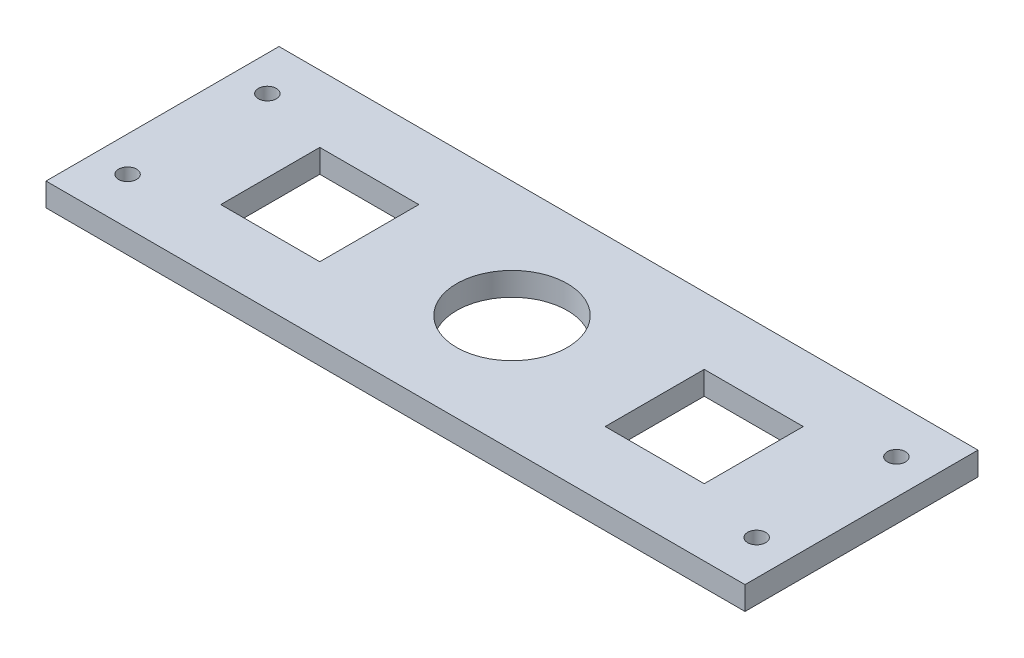
ISO-10303-21;
HEADER;
FILE_DESCRIPTION(('STEP AP214'),'2;1');
FILE_NAME('part.step','',(''),(''),'','','');
FILE_SCHEMA(('AUTOMOTIVE_DESIGN { 1 0 10303 214 1 1 1 1 }'));
ENDSEC;
DATA;
#1=APPLICATION_CONTEXT('core data for automotive mechanical design processes');
#2=APPLICATION_PROTOCOL_DEFINITION('international standard','automotive_design',2000,#1);
#3=PRODUCT_CONTEXT('',#1,'mechanical');
#4=PRODUCT('Part','Part','',(#3));
#5=PRODUCT_RELATED_PRODUCT_CATEGORY('part','',(#4));
#6=PRODUCT_DEFINITION_FORMATION('','',#4);
#7=PRODUCT_DEFINITION_CONTEXT('part definition',#1,'design');
#8=PRODUCT_DEFINITION('design','',#6,#7);
#9=PRODUCT_DEFINITION_SHAPE('','',#8);
#10=(LENGTH_UNIT() NAMED_UNIT(*) SI_UNIT(.MILLI.,.METRE.));
#11=(NAMED_UNIT(*) PLANE_ANGLE_UNIT() SI_UNIT($,.RADIAN.));
#12=(NAMED_UNIT(*) SI_UNIT($,.STERADIAN.) SOLID_ANGLE_UNIT());
#13=UNCERTAINTY_MEASURE_WITH_UNIT(LENGTH_MEASURE(1.E-05),#10,'distance_accuracy_value','');
#14=(GEOMETRIC_REPRESENTATION_CONTEXT(3) GLOBAL_UNCERTAINTY_ASSIGNED_CONTEXT((#13)) GLOBAL_UNIT_ASSIGNED_CONTEXT((#10,
#11,#12)) REPRESENTATION_CONTEXT('',''));
#15=CARTESIAN_POINT('',(0.,0.,0.));
#16=DIRECTION('',(0.,0.,1.));
#17=DIRECTION('',(1.,0.,0.));
#18=AXIS2_PLACEMENT_3D('',#15,#16,#17);
#19=CARTESIAN_POINT('',(0.,6.35,0.));
#20=DIRECTION('',(1.,0.,0.));
#21=DIRECTION('',(0.,0.,-1.));
#22=AXIS2_PLACEMENT_3D('',#19,#20,#21);
#23=PLANE('',#22);
#24=DIRECTION('',(0.,0.,1.));
#25=VECTOR('',#24,1.);
#26=CARTESIAN_POINT('',(0.,0.,0.));
#27=LINE('',#26,#25);
#28=CARTESIAN_POINT('',(0.,0.,-63.5));
#29=VERTEX_POINT('',#28);
#30=CARTESIAN_POINT('',(0.,0.,0.));
#31=VERTEX_POINT('',#30);
#32=EDGE_CURVE('E216',#29,#31,#27,.T.);
#33=ORIENTED_EDGE('',*,*,#32,.T.);
#34=DIRECTION('',(0.,-1.,0.));
#35=VECTOR('',#34,1.);
#36=CARTESIAN_POINT('',(0.,6.35,0.));
#37=LINE('',#36,#35);
#38=CARTESIAN_POINT('',(0.,6.35,0.));
#39=VERTEX_POINT('',#38);
#40=EDGE_CURVE('E12',#39,#31,#37,.T.);
#41=ORIENTED_EDGE('',*,*,#40,.F.);
#42=DIRECTION('',(0.,0.,1.));
#43=VECTOR('',#42,1.);
#44=CARTESIAN_POINT('',(0.,6.35,0.));
#45=LINE('',#44,#43);
#46=CARTESIAN_POINT('',(0.,6.35,-63.5));
#47=VERTEX_POINT('',#46);
#48=EDGE_CURVE('E223',#47,#39,#45,.T.);
#49=ORIENTED_EDGE('',*,*,#48,.F.);
#50=DIRECTION('',(0.,-1.,0.));
#51=VECTOR('',#50,1.);
#52=CARTESIAN_POINT('',(0.,6.35,-63.5));
#53=LINE('',#52,#51);
#54=EDGE_CURVE('E240',#47,#29,#53,.T.);
#55=ORIENTED_EDGE('',*,*,#54,.T.);
#56=EDGE_LOOP('',(#33,#41,#49,#55));
#57=FACE_BOUND('',#56,.T.);
#58=ADVANCED_FACE('F42',(#57),#23,.F.);
#59=CARTESIAN_POINT('',(0.,6.35,0.));
#60=DIRECTION('',(0.,0.,-1.));
#61=DIRECTION('',(-1.,0.,0.));
#62=AXIS2_PLACEMENT_3D('',#59,#60,#61);
#63=PLANE('',#62);
#64=DIRECTION('',(1.,0.,0.));
#65=VECTOR('',#64,1.);
#66=CARTESIAN_POINT('',(0.,0.,0.));
#67=LINE('',#66,#65);
#68=CARTESIAN_POINT('',(190.5,0.,0.));
#69=VERTEX_POINT('',#68);
#70=EDGE_CURVE('E243',#31,#69,#67,.T.);
#71=ORIENTED_EDGE('',*,*,#70,.T.);
#72=DIRECTION('',(0.,-1.,0.));
#73=VECTOR('',#72,1.);
#74=CARTESIAN_POINT('',(190.5,6.35,0.));
#75=LINE('',#74,#73);
#76=CARTESIAN_POINT('',(190.5,6.35,0.));
#77=VERTEX_POINT('',#76);
#78=EDGE_CURVE('E49',#77,#69,#75,.T.);
#79=ORIENTED_EDGE('',*,*,#78,.F.);
#80=DIRECTION('',(1.,0.,0.));
#81=VECTOR('',#80,1.);
#82=CARTESIAN_POINT('',(0.,6.35,0.));
#83=LINE('',#82,#81);
#84=EDGE_CURVE('E228',#39,#77,#83,.T.);
#85=ORIENTED_EDGE('',*,*,#84,.F.);
#86=ORIENTED_EDGE('',*,*,#40,.T.);
#87=EDGE_LOOP('',(#71,#79,#85,#86));
#88=FACE_BOUND('',#87,.T.);
#89=ADVANCED_FACE('F363',(#88),#63,.F.);
#90=CARTESIAN_POINT('',(190.5,6.35,0.));
#91=DIRECTION('',(-1.,0.,0.));
#92=DIRECTION('',(0.,0.,1.));
#93=AXIS2_PLACEMENT_3D('',#90,#91,#92);
#94=PLANE('',#93);
#95=DIRECTION('',(0.,0.,-1.));
#96=VECTOR('',#95,1.);
#97=CARTESIAN_POINT('',(190.5,0.,0.));
#98=LINE('',#97,#96);
#99=CARTESIAN_POINT('',(190.5,0.,-63.5));
#100=VERTEX_POINT('',#99);
#101=EDGE_CURVE('E245',#69,#100,#98,.T.);
#102=ORIENTED_EDGE('',*,*,#101,.T.);
#103=DIRECTION('',(0.,-1.,0.));
#104=VECTOR('',#103,1.);
#105=CARTESIAN_POINT('',(190.5,6.35,-63.5));
#106=LINE('',#105,#104);
#107=CARTESIAN_POINT('',(190.5,6.35,-63.5));
#108=VERTEX_POINT('',#107);
#109=EDGE_CURVE('E250',#108,#100,#106,.T.);
#110=ORIENTED_EDGE('',*,*,#109,.F.);
#111=DIRECTION('',(0.,0.,-1.));
#112=VECTOR('',#111,1.);
#113=CARTESIAN_POINT('',(190.5,6.35,0.));
#114=LINE('',#113,#112);
#115=EDGE_CURVE('E233',#77,#108,#114,.T.);
#116=ORIENTED_EDGE('',*,*,#115,.F.);
#117=ORIENTED_EDGE('',*,*,#78,.T.);
#118=EDGE_LOOP('',(#102,#110,#116,#117));
#119=FACE_BOUND('',#118,.T.);
#120=ADVANCED_FACE('F257',(#119),#94,.F.);
#121=CARTESIAN_POINT('',(0.,6.35,-63.5));
#122=DIRECTION('',(0.,0.,1.));
#123=DIRECTION('',(1.,0.,0.));
#124=AXIS2_PLACEMENT_3D('',#121,#122,#123);
#125=PLANE('',#124);
#126=DIRECTION('',(-1.,0.,0.));
#127=VECTOR('',#126,1.);
#128=CARTESIAN_POINT('',(0.,0.,-63.5));
#129=LINE('',#128,#127);
#130=EDGE_CURVE('E229',#100,#29,#129,.T.);
#131=ORIENTED_EDGE('',*,*,#130,.T.);
#132=ORIENTED_EDGE('',*,*,#54,.F.);
#133=DIRECTION('',(-1.,0.,0.));
#134=VECTOR('',#133,1.);
#135=CARTESIAN_POINT('',(0.,6.35,-63.5));
#136=LINE('',#135,#134);
#137=EDGE_CURVE('E236',#108,#47,#136,.T.);
#138=ORIENTED_EDGE('',*,*,#137,.F.);
#139=ORIENTED_EDGE('',*,*,#109,.T.);
#140=EDGE_LOOP('',(#131,#132,#138,#139));
#141=FACE_BOUND('',#140,.T.);
#142=ADVANCED_FACE('F265',(#141),#125,.F.);
#143=CARTESIAN_POINT('',(0.,6.35,0.));
#144=DIRECTION('',(0.,-1.,0.));
#145=DIRECTION('',(0.,0.,-1.));
#146=AXIS2_PLACEMENT_3D('',#143,#144,#145);
#147=PLANE('',#146);
#148=CARTESIAN_POINT('',(9.52500000000001,6.35,-50.8));
#149=DIRECTION('',(0.,1.,0.));
#150=DIRECTION('',(0.,0.,1.));
#151=AXIS2_PLACEMENT_3D('',#148,#149,#150);
#152=CIRCLE('',#151,2.45745);
#153=CARTESIAN_POINT('',(9.52500000000001,6.35,-48.34255));
#154=VERTEX_POINT('',#153);
#155=EDGE_CURVE('E299',#154,#154,#152,.T.);
#156=ORIENTED_EDGE('',*,*,#155,.F.);
#157=EDGE_LOOP('',(#156));
#158=FACE_BOUND('',#157,.T.);
#159=CARTESIAN_POINT('',(9.525,6.35,-12.7));
#160=DIRECTION('',(0.,1.,0.));
#161=DIRECTION('',(0.,0.,1.));
#162=AXIS2_PLACEMENT_3D('',#159,#160,#161);
#163=CIRCLE('',#162,2.45745);
#164=CARTESIAN_POINT('',(9.525,6.35,-10.24255));
#165=VERTEX_POINT('',#164);
#166=EDGE_CURVE('E294',#165,#165,#163,.T.);
#167=ORIENTED_EDGE('',*,*,#166,.F.);
#168=EDGE_LOOP('',(#167));
#169=FACE_BOUND('',#168,.T.);
#170=CARTESIAN_POINT('',(180.975,6.35,-12.7));
#171=DIRECTION('',(0.,1.,0.));
#172=DIRECTION('',(0.,0.,1.));
#173=AXIS2_PLACEMENT_3D('',#170,#171,#172);
#174=CIRCLE('',#173,2.45745);
#175=CARTESIAN_POINT('',(180.975,6.35,-10.24255));
#176=VERTEX_POINT('',#175);
#177=EDGE_CURVE('E289',#176,#176,#174,.T.);
#178=ORIENTED_EDGE('',*,*,#177,.F.);
#179=EDGE_LOOP('',(#178));
#180=FACE_BOUND('',#179,.T.);
#181=CARTESIAN_POINT('',(180.975,6.35,-50.8));
#182=DIRECTION('',(0.,1.,0.));
#183=DIRECTION('',(0.,0.,1.));
#184=AXIS2_PLACEMENT_3D('',#181,#182,#183);
#185=CIRCLE('',#184,2.45745);
#186=CARTESIAN_POINT('',(180.975,6.35,-48.34255));
#187=VERTEX_POINT('',#186);
#188=EDGE_CURVE('E284',#187,#187,#185,.T.);
#189=ORIENTED_EDGE('',*,*,#188,.F.);
#190=EDGE_LOOP('',(#189));
#191=FACE_BOUND('',#190,.T.);
#192=CARTESIAN_POINT('',(95.25,6.35,-31.75));
#193=DIRECTION('',(0.,1.,0.));
#194=DIRECTION('',(0.,0.,1.));
#195=AXIS2_PLACEMENT_3D('',#192,#193,#194);
#196=CIRCLE('',#195,15.08125);
#197=CARTESIAN_POINT('',(95.25,6.35,-16.66875));
#198=VERTEX_POINT('',#197);
#199=EDGE_CURVE('E155',#198,#198,#196,.T.);
#200=ORIENTED_EDGE('',*,*,#199,.F.);
#201=EDGE_LOOP('',(#200));
#202=FACE_BOUND('',#201,.T.);
#203=DIRECTION('',(1.,0.,0.));
#204=VECTOR('',#203,1.);
#205=CARTESIAN_POINT('',(134.14375,6.35,-18.25625));
#206=LINE('',#205,#204);
#207=CARTESIAN_POINT('',(134.14375,6.35,-18.25625));
#208=VERTEX_POINT('',#207);
#209=CARTESIAN_POINT('',(161.13125,6.35,-18.25625));
#210=VERTEX_POINT('',#209);
#211=EDGE_CURVE('E164',#208,#210,#206,.T.);
#212=ORIENTED_EDGE('',*,*,#211,.F.);
#213=DIRECTION('',(0.,0.,1.));
#214=VECTOR('',#213,1.);
#215=CARTESIAN_POINT('',(134.14375,6.35,-45.24375));
#216=LINE('',#215,#214);
#217=CARTESIAN_POINT('',(134.14375,6.35,-45.24375));
#218=VERTEX_POINT('',#217);
#219=EDGE_CURVE('E56',#218,#208,#216,.T.);
#220=ORIENTED_EDGE('',*,*,#219,.F.);
#221=DIRECTION('',(-1.,0.,0.));
#222=VECTOR('',#221,1.);
#223=CARTESIAN_POINT('',(134.14375,6.35,-45.24375));
#224=LINE('',#223,#222);
#225=CARTESIAN_POINT('',(161.13125,6.35,-45.24375));
#226=VERTEX_POINT('',#225);
#227=EDGE_CURVE('E148',#226,#218,#224,.T.);
#228=ORIENTED_EDGE('',*,*,#227,.F.);
#229=DIRECTION('',(0.,0.,-1.));
#230=VECTOR('',#229,1.);
#231=CARTESIAN_POINT('',(161.13125,6.35,-45.24375));
#232=LINE('',#231,#230);
#233=EDGE_CURVE('E152',#210,#226,#232,.T.);
#234=ORIENTED_EDGE('',*,*,#233,.F.);
#235=EDGE_LOOP('',(#212,#220,#228,#234));
#236=FACE_BOUND('',#235,.T.);
#237=DIRECTION('',(1.,0.,0.));
#238=VECTOR('',#237,1.);
#239=CARTESIAN_POINT('',(29.36875,6.35,-18.25625));
#240=LINE('',#239,#238);
#241=CARTESIAN_POINT('',(29.36875,6.35,-18.25625));
#242=VERTEX_POINT('',#241);
#243=CARTESIAN_POINT('',(56.35625,6.35,-18.25625));
#244=VERTEX_POINT('',#243);
#245=EDGE_CURVE('E200',#242,#244,#240,.T.);
#246=ORIENTED_EDGE('',*,*,#245,.F.);
#247=DIRECTION('',(0.,0.,1.));
#248=VECTOR('',#247,1.);
#249=CARTESIAN_POINT('',(29.36875,6.35,-45.24375));
#250=LINE('',#249,#248);
#251=CARTESIAN_POINT('',(29.36875,6.35,-45.24375));
#252=VERTEX_POINT('',#251);
#253=EDGE_CURVE('E179',#252,#242,#250,.T.);
#254=ORIENTED_EDGE('',*,*,#253,.F.);
#255=DIRECTION('',(-1.,0.,0.));
#256=VECTOR('',#255,1.);
#257=CARTESIAN_POINT('',(29.36875,6.35,-45.24375));
#258=LINE('',#257,#256);
#259=CARTESIAN_POINT('',(56.35625,6.35,-45.24375));
#260=VERTEX_POINT('',#259);
#261=EDGE_CURVE('E187',#260,#252,#258,.T.);
#262=ORIENTED_EDGE('',*,*,#261,.F.);
#263=DIRECTION('',(0.,0.,-1.));
#264=VECTOR('',#263,1.);
#265=CARTESIAN_POINT('',(56.35625,6.35,-45.24375));
#266=LINE('',#265,#264);
#267=EDGE_CURVE('E212',#244,#260,#266,.T.);
#268=ORIENTED_EDGE('',*,*,#267,.F.);
#269=EDGE_LOOP('',(#246,#254,#262,#268));
#270=FACE_BOUND('',#269,.T.);
#271=ORIENTED_EDGE('',*,*,#48,.T.);
#272=ORIENTED_EDGE('',*,*,#84,.T.);
#273=ORIENTED_EDGE('',*,*,#115,.T.);
#274=ORIENTED_EDGE('',*,*,#137,.T.);
#275=EDGE_LOOP('',(#271,#272,#273,#274));
#276=FACE_BOUND('',#275,.T.);
#277=ADVANCED_FACE('F271',(#158,#169,#180,#191,#202,#236,#270,#276),#147,.F.);
#278=CARTESIAN_POINT('',(0.,0.,0.));
#279=DIRECTION('',(0.,-1.,0.));
#280=DIRECTION('',(0.,0.,-1.));
#281=AXIS2_PLACEMENT_3D('',#278,#279,#280);
#282=PLANE('',#281);
#283=CARTESIAN_POINT('',(9.52500000000001,0.,-50.8));
#284=DIRECTION('',(0.,1.,0.));
#285=DIRECTION('',(0.,0.,1.));
#286=AXIS2_PLACEMENT_3D('',#283,#284,#285);
#287=CIRCLE('',#286,2.45745);
#288=CARTESIAN_POINT('',(9.52500000000001,0.,-48.34255));
#289=VERTEX_POINT('',#288);
#290=EDGE_CURVE('E297',#289,#289,#287,.T.);
#291=ORIENTED_EDGE('',*,*,#290,.T.);
#292=EDGE_LOOP('',(#291));
#293=FACE_BOUND('',#292,.T.);
#294=CARTESIAN_POINT('',(9.525,0.,-12.7));
#295=DIRECTION('',(0.,1.,0.));
#296=DIRECTION('',(0.,0.,1.));
#297=AXIS2_PLACEMENT_3D('',#294,#295,#296);
#298=CIRCLE('',#297,2.45745);
#299=CARTESIAN_POINT('',(9.525,0.,-10.24255));
#300=VERTEX_POINT('',#299);
#301=EDGE_CURVE('E292',#300,#300,#298,.T.);
#302=ORIENTED_EDGE('',*,*,#301,.T.);
#303=EDGE_LOOP('',(#302));
#304=FACE_BOUND('',#303,.T.);
#305=CARTESIAN_POINT('',(180.975,0.,-12.7));
#306=DIRECTION('',(0.,1.,0.));
#307=DIRECTION('',(0.,0.,1.));
#308=AXIS2_PLACEMENT_3D('',#305,#306,#307);
#309=CIRCLE('',#308,2.45745);
#310=CARTESIAN_POINT('',(180.975,0.,-10.24255));
#311=VERTEX_POINT('',#310);
#312=EDGE_CURVE('E287',#311,#311,#309,.T.);
#313=ORIENTED_EDGE('',*,*,#312,.T.);
#314=EDGE_LOOP('',(#313));
#315=FACE_BOUND('',#314,.T.);
#316=CARTESIAN_POINT('',(180.975,0.,-50.8));
#317=DIRECTION('',(0.,1.,0.));
#318=DIRECTION('',(0.,0.,1.));
#319=AXIS2_PLACEMENT_3D('',#316,#317,#318);
#320=CIRCLE('',#319,2.45745);
#321=CARTESIAN_POINT('',(180.975,0.,-48.34255));
#322=VERTEX_POINT('',#321);
#323=EDGE_CURVE('E283',#322,#322,#320,.T.);
#324=ORIENTED_EDGE('',*,*,#323,.T.);
#325=EDGE_LOOP('',(#324));
#326=FACE_BOUND('',#325,.T.);
#327=CARTESIAN_POINT('',(95.25,0.,-31.75));
#328=DIRECTION('',(0.,1.,0.));
#329=DIRECTION('',(0.,0.,1.));
#330=AXIS2_PLACEMENT_3D('',#327,#328,#329);
#331=CIRCLE('',#330,15.08125);
#332=CARTESIAN_POINT('',(95.25,0.,-16.66875));
#333=VERTEX_POINT('',#332);
#334=EDGE_CURVE('E165',#333,#333,#331,.T.);
#335=ORIENTED_EDGE('',*,*,#334,.T.);
#336=EDGE_LOOP('',(#335));
#337=FACE_BOUND('',#336,.T.);
#338=DIRECTION('',(0.,0.,1.));
#339=VECTOR('',#338,1.);
#340=CARTESIAN_POINT('',(134.14375,0.,-45.24375));
#341=LINE('',#340,#339);
#342=CARTESIAN_POINT('',(134.14375,0.,-45.24375));
#343=VERTEX_POINT('',#342);
#344=CARTESIAN_POINT('',(134.14375,0.,-18.25625));
#345=VERTEX_POINT('',#344);
#346=EDGE_CURVE('E132',#343,#345,#341,.T.);
#347=ORIENTED_EDGE('',*,*,#346,.T.);
#348=DIRECTION('',(1.,0.,0.));
#349=VECTOR('',#348,1.);
#350=CARTESIAN_POINT('',(134.14375,0.,-18.25625));
#351=LINE('',#350,#349);
#352=CARTESIAN_POINT('',(161.13125,0.,-18.25625));
#353=VERTEX_POINT('',#352);
#354=EDGE_CURVE('E141',#345,#353,#351,.T.);
#355=ORIENTED_EDGE('',*,*,#354,.T.);
#356=DIRECTION('',(0.,0.,-1.));
#357=VECTOR('',#356,1.);
#358=CARTESIAN_POINT('',(161.13125,0.,-45.24375));
#359=LINE('',#358,#357);
#360=CARTESIAN_POINT('',(161.13125,0.,-45.24375));
#361=VERTEX_POINT('',#360);
#362=EDGE_CURVE('E64',#353,#361,#359,.T.);
#363=ORIENTED_EDGE('',*,*,#362,.T.);
#364=DIRECTION('',(-1.,0.,0.));
#365=VECTOR('',#364,1.);
#366=CARTESIAN_POINT('',(134.14375,0.,-45.24375));
#367=LINE('',#366,#365);
#368=EDGE_CURVE('E138',#361,#343,#367,.T.);
#369=ORIENTED_EDGE('',*,*,#368,.T.);
#370=EDGE_LOOP('',(#347,#355,#363,#369));
#371=FACE_BOUND('',#370,.T.);
#372=DIRECTION('',(0.,0.,1.));
#373=VECTOR('',#372,1.);
#374=CARTESIAN_POINT('',(29.36875,0.,-45.24375));
#375=LINE('',#374,#373);
#376=CARTESIAN_POINT('',(29.36875,0.,-45.24375));
#377=VERTEX_POINT('',#376);
#378=CARTESIAN_POINT('',(29.36875,0.,-18.25625));
#379=VERTEX_POINT('',#378);
#380=EDGE_CURVE('E183',#377,#379,#375,.T.);
#381=ORIENTED_EDGE('',*,*,#380,.T.);
#382=DIRECTION('',(1.,0.,0.));
#383=VECTOR('',#382,1.);
#384=CARTESIAN_POINT('',(29.36875,0.,-18.25625));
#385=LINE('',#384,#383);
#386=CARTESIAN_POINT('',(56.35625,0.,-18.25625));
#387=VERTEX_POINT('',#386);
#388=EDGE_CURVE('E186',#379,#387,#385,.T.);
#389=ORIENTED_EDGE('',*,*,#388,.T.);
#390=DIRECTION('',(0.,0.,-1.));
#391=VECTOR('',#390,1.);
#392=CARTESIAN_POINT('',(56.35625,0.,-45.24375));
#393=LINE('',#392,#391);
#394=CARTESIAN_POINT('',(56.35625,0.,-45.24375));
#395=VERTEX_POINT('',#394);
#396=EDGE_CURVE('E190',#387,#395,#393,.T.);
#397=ORIENTED_EDGE('',*,*,#396,.T.);
#398=DIRECTION('',(-1.,0.,0.));
#399=VECTOR('',#398,1.);
#400=CARTESIAN_POINT('',(29.36875,0.,-45.24375));
#401=LINE('',#400,#399);
#402=EDGE_CURVE('E193',#395,#377,#401,.T.);
#403=ORIENTED_EDGE('',*,*,#402,.T.);
#404=EDGE_LOOP('',(#381,#389,#397,#403));
#405=FACE_BOUND('',#404,.T.);
#406=ORIENTED_EDGE('',*,*,#32,.F.);
#407=ORIENTED_EDGE('',*,*,#130,.F.);
#408=ORIENTED_EDGE('',*,*,#101,.F.);
#409=ORIENTED_EDGE('',*,*,#70,.F.);
#410=EDGE_LOOP('',(#406,#407,#408,#409));
#411=FACE_BOUND('',#410,.T.);
#412=ADVANCED_FACE('F145',(#293,#304,#315,#326,#337,#371,#405,#411),#282,.T.);
#413=CARTESIAN_POINT('',(29.36875,0.,-45.24375));
#414=DIRECTION('',(-1.,0.,0.));
#415=DIRECTION('',(0.,0.,1.));
#416=AXIS2_PLACEMENT_3D('',#413,#414,#415);
#417=PLANE('',#416);
#418=ORIENTED_EDGE('',*,*,#253,.T.);
#419=DIRECTION('',(0.,1.,0.));
#420=VECTOR('',#419,1.);
#421=CARTESIAN_POINT('',(29.36875,0.,-18.25625));
#422=LINE('',#421,#420);
#423=EDGE_CURVE('E196',#379,#242,#422,.T.);
#424=ORIENTED_EDGE('',*,*,#423,.F.);
#425=ORIENTED_EDGE('',*,*,#380,.F.);
#426=DIRECTION('',(0.,1.,0.));
#427=VECTOR('',#426,1.);
#428=CARTESIAN_POINT('',(29.36875,0.,-45.24375));
#429=LINE('',#428,#427);
#430=EDGE_CURVE('E214',#377,#252,#429,.T.);
#431=ORIENTED_EDGE('',*,*,#430,.T.);
#432=EDGE_LOOP('',(#418,#424,#425,#431));
#433=FACE_BOUND('',#432,.T.);
#434=ADVANCED_FACE('F347',(#433),#417,.F.);
#435=CARTESIAN_POINT('',(29.36875,0.,-45.24375));
#436=DIRECTION('',(0.,0.,-1.));
#437=DIRECTION('',(-1.,0.,0.));
#438=AXIS2_PLACEMENT_3D('',#435,#436,#437);
#439=PLANE('',#438);
#440=ORIENTED_EDGE('',*,*,#261,.T.);
#441=ORIENTED_EDGE('',*,*,#430,.F.);
#442=ORIENTED_EDGE('',*,*,#402,.F.);
#443=DIRECTION('',(0.,1.,0.));
#444=VECTOR('',#443,1.);
#445=CARTESIAN_POINT('',(56.35625,0.,-45.24375));
#446=LINE('',#445,#444);
#447=EDGE_CURVE('E217',#395,#260,#446,.T.);
#448=ORIENTED_EDGE('',*,*,#447,.T.);
#449=EDGE_LOOP('',(#440,#441,#442,#448));
#450=FACE_BOUND('',#449,.T.);
#451=ADVANCED_FACE('F350',(#450),#439,.F.);
#452=CARTESIAN_POINT('',(56.35625,0.,-45.24375));
#453=DIRECTION('',(1.,0.,0.));
#454=DIRECTION('',(0.,0.,-1.));
#455=AXIS2_PLACEMENT_3D('',#452,#453,#454);
#456=PLANE('',#455);
#457=ORIENTED_EDGE('',*,*,#267,.T.);
#458=ORIENTED_EDGE('',*,*,#447,.F.);
#459=ORIENTED_EDGE('',*,*,#396,.F.);
#460=DIRECTION('',(0.,1.,0.));
#461=VECTOR('',#460,1.);
#462=CARTESIAN_POINT('',(56.35625,0.,-18.25625));
#463=LINE('',#462,#461);
#464=EDGE_CURVE('E219',#387,#244,#463,.T.);
#465=ORIENTED_EDGE('',*,*,#464,.T.);
#466=EDGE_LOOP('',(#457,#458,#459,#465));
#467=FACE_BOUND('',#466,.T.);
#468=ADVANCED_FACE('F352',(#467),#456,.F.);
#469=CARTESIAN_POINT('',(29.36875,0.,-18.25625));
#470=DIRECTION('',(0.,0.,1.));
#471=DIRECTION('',(1.,0.,0.));
#472=AXIS2_PLACEMENT_3D('',#469,#470,#471);
#473=PLANE('',#472);
#474=ORIENTED_EDGE('',*,*,#245,.T.);
#475=ORIENTED_EDGE('',*,*,#464,.F.);
#476=ORIENTED_EDGE('',*,*,#388,.F.);
#477=ORIENTED_EDGE('',*,*,#423,.T.);
#478=EDGE_LOOP('',(#474,#475,#476,#477));
#479=FACE_BOUND('',#478,.T.);
#480=ADVANCED_FACE('F343',(#479),#473,.F.);
#481=CARTESIAN_POINT('',(134.14375,0.,-45.24375));
#482=DIRECTION('',(-1.,0.,0.));
#483=DIRECTION('',(0.,0.,1.));
#484=AXIS2_PLACEMENT_3D('',#481,#482,#483);
#485=PLANE('',#484);
#486=ORIENTED_EDGE('',*,*,#219,.T.);
#487=DIRECTION('',(0.,1.,0.));
#488=VECTOR('',#487,1.);
#489=CARTESIAN_POINT('',(134.14375,0.,-18.25625));
#490=LINE('',#489,#488);
#491=EDGE_CURVE('E128',#345,#208,#490,.T.);
#492=ORIENTED_EDGE('',*,*,#491,.F.);
#493=ORIENTED_EDGE('',*,*,#346,.F.);
#494=DIRECTION('',(0.,1.,0.));
#495=VECTOR('',#494,1.);
#496=CARTESIAN_POINT('',(134.14375,0.,-45.24375));
#497=LINE('',#496,#495);
#498=EDGE_CURVE('E177',#343,#218,#497,.T.);
#499=ORIENTED_EDGE('',*,*,#498,.T.);
#500=EDGE_LOOP('',(#486,#492,#493,#499));
#501=FACE_BOUND('',#500,.T.);
#502=ADVANCED_FACE('F130',(#501),#485,.F.);
#503=CARTESIAN_POINT('',(134.14375,0.,-45.24375));
#504=DIRECTION('',(0.,0.,-1.));
#505=DIRECTION('',(-1.,0.,0.));
#506=AXIS2_PLACEMENT_3D('',#503,#504,#505);
#507=PLANE('',#506);
#508=ORIENTED_EDGE('',*,*,#227,.T.);
#509=ORIENTED_EDGE('',*,*,#498,.F.);
#510=ORIENTED_EDGE('',*,*,#368,.F.);
#511=DIRECTION('',(0.,1.,0.));
#512=VECTOR('',#511,1.);
#513=CARTESIAN_POINT('',(161.13125,0.,-45.24375));
#514=LINE('',#513,#512);
#515=EDGE_CURVE('E180',#361,#226,#514,.T.);
#516=ORIENTED_EDGE('',*,*,#515,.T.);
#517=EDGE_LOOP('',(#508,#509,#510,#516));
#518=FACE_BOUND('',#517,.T.);
#519=ADVANCED_FACE('F435',(#518),#507,.F.);
#520=CARTESIAN_POINT('',(161.13125,0.,-45.24375));
#521=DIRECTION('',(1.,0.,0.));
#522=DIRECTION('',(0.,0.,-1.));
#523=AXIS2_PLACEMENT_3D('',#520,#521,#522);
#524=PLANE('',#523);
#525=ORIENTED_EDGE('',*,*,#233,.T.);
#526=ORIENTED_EDGE('',*,*,#515,.F.);
#527=ORIENTED_EDGE('',*,*,#362,.F.);
#528=DIRECTION('',(0.,1.,0.));
#529=VECTOR('',#528,1.);
#530=CARTESIAN_POINT('',(161.13125,0.,-18.25625));
#531=LINE('',#530,#529);
#532=EDGE_CURVE('E137',#353,#210,#531,.T.);
#533=ORIENTED_EDGE('',*,*,#532,.T.);
#534=EDGE_LOOP('',(#525,#526,#527,#533));
#535=FACE_BOUND('',#534,.T.);
#536=ADVANCED_FACE('F438',(#535),#524,.F.);
#537=CARTESIAN_POINT('',(134.14375,0.,-18.25625));
#538=DIRECTION('',(0.,0.,1.));
#539=DIRECTION('',(1.,0.,0.));
#540=AXIS2_PLACEMENT_3D('',#537,#538,#539);
#541=PLANE('',#540);
#542=ORIENTED_EDGE('',*,*,#211,.T.);
#543=ORIENTED_EDGE('',*,*,#532,.F.);
#544=ORIENTED_EDGE('',*,*,#354,.F.);
#545=ORIENTED_EDGE('',*,*,#491,.T.);
#546=EDGE_LOOP('',(#542,#543,#544,#545));
#547=FACE_BOUND('',#546,.T.);
#548=ADVANCED_FACE('F142',(#547),#541,.F.);
#549=CARTESIAN_POINT('',(95.25,0.,-31.75));
#550=DIRECTION('',(0.,1.,0.));
#551=DIRECTION('',(0.,0.,1.));
#552=AXIS2_PLACEMENT_3D('',#549,#550,#551);
#553=CYLINDRICAL_SURFACE('',#552,15.08125);
#554=ORIENTED_EDGE('',*,*,#334,.F.);
#555=EDGE_LOOP('',(#554));
#556=FACE_BOUND('',#555,.T.);
#557=ORIENTED_EDGE('',*,*,#199,.T.);
#558=EDGE_LOOP('',(#557));
#559=FACE_BOUND('',#558,.T.);
#560=ADVANCED_FACE('F324',(#556,#559),#553,.F.);
#561=CARTESIAN_POINT('',(180.975,6.35,-50.8));
#562=DIRECTION('',(0.,1.,0.));
#563=DIRECTION('',(0.,0.,1.));
#564=AXIS2_PLACEMENT_3D('',#561,#562,#563);
#565=CYLINDRICAL_SURFACE('',#564,2.45745);
#566=ORIENTED_EDGE('',*,*,#323,.F.);
#567=EDGE_LOOP('',(#566));
#568=FACE_BOUND('',#567,.T.);
#569=ORIENTED_EDGE('',*,*,#188,.T.);
#570=EDGE_LOOP('',(#569));
#571=FACE_BOUND('',#570,.T.);
#572=ADVANCED_FACE('F327',(#568,#571),#565,.F.);
#573=CARTESIAN_POINT('',(180.975,6.35,-12.7));
#574=DIRECTION('',(0.,1.,0.));
#575=DIRECTION('',(0.,0.,1.));
#576=AXIS2_PLACEMENT_3D('',#573,#574,#575);
#577=CYLINDRICAL_SURFACE('',#576,2.45745);
#578=ORIENTED_EDGE('',*,*,#312,.F.);
#579=EDGE_LOOP('',(#578));
#580=FACE_BOUND('',#579,.T.);
#581=ORIENTED_EDGE('',*,*,#177,.T.);
#582=EDGE_LOOP('',(#581));
#583=FACE_BOUND('',#582,.T.);
#584=ADVANCED_FACE('F399',(#580,#583),#577,.F.);
#585=CARTESIAN_POINT('',(9.525,6.35,-12.7));
#586=DIRECTION('',(0.,1.,0.));
#587=DIRECTION('',(0.,0.,1.));
#588=AXIS2_PLACEMENT_3D('',#585,#586,#587);
#589=CYLINDRICAL_SURFACE('',#588,2.45745);
#590=ORIENTED_EDGE('',*,*,#301,.F.);
#591=EDGE_LOOP('',(#590));
#592=FACE_BOUND('',#591,.T.);
#593=ORIENTED_EDGE('',*,*,#166,.T.);
#594=EDGE_LOOP('',(#593));
#595=FACE_BOUND('',#594,.T.);
#596=ADVANCED_FACE('F409',(#592,#595),#589,.F.);
#597=CARTESIAN_POINT('',(9.52500000000001,6.35,-50.8));
#598=DIRECTION('',(0.,1.,0.));
#599=DIRECTION('',(0.,0.,1.));
#600=AXIS2_PLACEMENT_3D('',#597,#598,#599);
#601=CYLINDRICAL_SURFACE('',#600,2.45745);
#602=ORIENTED_EDGE('',*,*,#290,.F.);
#603=EDGE_LOOP('',(#602));
#604=FACE_BOUND('',#603,.T.);
#605=ORIENTED_EDGE('',*,*,#155,.T.);
#606=EDGE_LOOP('',(#605));
#607=FACE_BOUND('',#606,.T.);
#608=ADVANCED_FACE('F419',(#604,#607),#601,.F.);
#609=CLOSED_SHELL('',(#58,#89,#120,#142,#277,#412,#434,#451,#468,#480,#502,#519,#536,#548,#560,
#572,#584,#596,#608));
#610=MANIFOLD_SOLID_BREP('B2',#609);
#611=ADVANCED_BREP_SHAPE_REPRESENTATION('',(#18,#610),#14);
#612=SHAPE_DEFINITION_REPRESENTATION(#9,#611);
ENDSEC;
END-ISO-10303-21;
